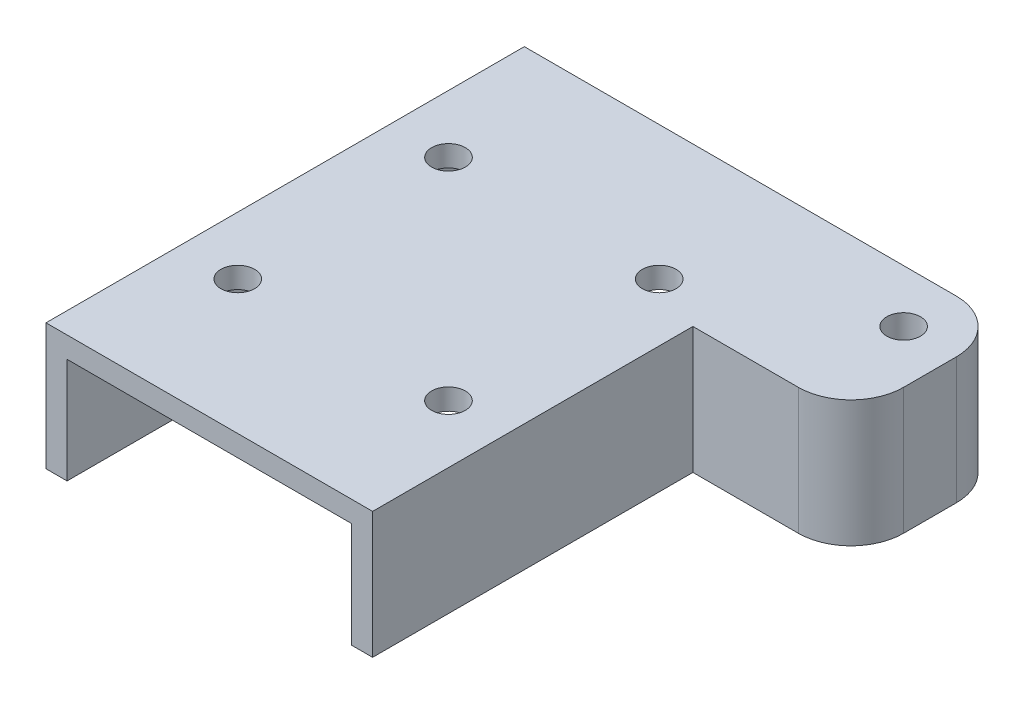
ISO-10303-21;
HEADER;
FILE_DESCRIPTION(('STEP AP214'),'2;1');
FILE_NAME('part.step','',(''),(''),'','','');
FILE_SCHEMA(('AUTOMOTIVE_DESIGN { 1 0 10303 214 1 1 1 1 }'));
ENDSEC;
DATA;
#1=APPLICATION_CONTEXT('core data for automotive mechanical design processes');
#2=APPLICATION_PROTOCOL_DEFINITION('international standard','automotive_design',2000,#1);
#3=PRODUCT_CONTEXT('',#1,'mechanical');
#4=PRODUCT('Part','Part','',(#3));
#5=PRODUCT_RELATED_PRODUCT_CATEGORY('part','',(#4));
#6=PRODUCT_DEFINITION_FORMATION('','',#4);
#7=PRODUCT_DEFINITION_CONTEXT('part definition',#1,'design');
#8=PRODUCT_DEFINITION('design','',#6,#7);
#9=PRODUCT_DEFINITION_SHAPE('','',#8);
#10=(LENGTH_UNIT() NAMED_UNIT(*) SI_UNIT(.MILLI.,.METRE.));
#11=(NAMED_UNIT(*) PLANE_ANGLE_UNIT() SI_UNIT($,.RADIAN.));
#12=(NAMED_UNIT(*) SI_UNIT($,.STERADIAN.) SOLID_ANGLE_UNIT());
#13=UNCERTAINTY_MEASURE_WITH_UNIT(LENGTH_MEASURE(1.E-05),#10,'distance_accuracy_value','');
#14=(GEOMETRIC_REPRESENTATION_CONTEXT(3) GLOBAL_UNCERTAINTY_ASSIGNED_CONTEXT((#13)) GLOBAL_UNIT_ASSIGNED_CONTEXT((#10,
#11,#12)) REPRESENTATION_CONTEXT('',''));
#15=CARTESIAN_POINT('',(0.,0.,0.));
#16=DIRECTION('',(0.,0.,1.));
#17=DIRECTION('',(1.,0.,0.));
#18=AXIS2_PLACEMENT_3D('',#15,#16,#17);
#19=CARTESIAN_POINT('',(62.,12.,-90.8));
#20=DIRECTION('',(-1.,0.,0.));
#21=DIRECTION('',(0.,0.,1.));
#22=AXIS2_PLACEMENT_3D('',#19,#20,#21);
#23=PLANE('',#22);
#24=DIRECTION('',(0.,-1.,0.));
#25=VECTOR('',#24,1.);
#26=CARTESIAN_POINT('',(62.,12.,-75.8));
#27=LINE('',#26,#25);
#28=CARTESIAN_POINT('',(62.,12.,-75.8));
#29=VERTEX_POINT('',#28);
#30=CARTESIAN_POINT('',(62.,0.,-75.8));
#31=VERTEX_POINT('',#30);
#32=EDGE_CURVE('E140',#29,#31,#27,.T.);
#33=ORIENTED_EDGE('',*,*,#32,.F.);
#34=DIRECTION('',(0.,0.,-1.));
#35=VECTOR('',#34,1.);
#36=CARTESIAN_POINT('',(62.,12.,-90.8));
#37=LINE('',#36,#35);
#38=CARTESIAN_POINT('',(62.,12.,-45.4));
#39=VERTEX_POINT('',#38);
#40=EDGE_CURVE('E198',#39,#29,#37,.T.);
#41=ORIENTED_EDGE('',*,*,#40,.F.);
#42=DIRECTION('',(0.,-1.,0.));
#43=VECTOR('',#42,1.);
#44=CARTESIAN_POINT('',(62.,12.,-45.4));
#45=LINE('',#44,#43);
#46=CARTESIAN_POINT('',(62.,0.,-45.4));
#47=VERTEX_POINT('',#46);
#48=EDGE_CURVE('E142',#39,#47,#45,.T.);
#49=ORIENTED_EDGE('',*,*,#48,.T.);
#50=DIRECTION('',(0.,0.,-1.));
#51=VECTOR('',#50,1.);
#52=CARTESIAN_POINT('',(62.,0.,-90.8));
#53=LINE('',#52,#51);
#54=EDGE_CURVE('E129',#47,#31,#53,.T.);
#55=ORIENTED_EDGE('',*,*,#54,.T.);
#56=EDGE_LOOP('',(#33,#41,#49,#55));
#57=FACE_BOUND('',#56,.T.);
#58=ADVANCED_FACE('F34',(#57),#23,.F.);
#59=CARTESIAN_POINT('',(62.,0.,-90.8));
#60=DIRECTION('',(0.,-1.,0.));
#61=DIRECTION('',(0.,0.,1.));
#62=AXIS2_PLACEMENT_3D('',#59,#60,#61);
#63=PLANE('',#62);
#64=CARTESIAN_POINT('',(72.,0.,-85.8));
#65=DIRECTION('',(0.,-1.,0.));
#66=DIRECTION('',(0.,0.,1.));
#67=AXIS2_PLACEMENT_3D('',#64,#65,#66);
#68=CIRCLE('',#67,1.6);
#69=CARTESIAN_POINT('',(72.,0.,-84.2));
#70=VERTEX_POINT('',#69);
#71=EDGE_CURVE('E150',#70,#70,#68,.T.);
#72=ORIENTED_EDGE('',*,*,#71,.F.);
#73=EDGE_LOOP('',(#72));
#74=FACE_BOUND('',#73,.T.);
#75=DIRECTION('',(0.,0.,-1.));
#76=VECTOR('',#75,1.);
#77=CARTESIAN_POINT('',(77.,0.,-75.8));
#78=LINE('',#77,#76);
#79=CARTESIAN_POINT('',(77.,0.,-80.8));
#80=VERTEX_POINT('',#79);
#81=CARTESIAN_POINT('',(77.,0.,-85.8));
#82=VERTEX_POINT('',#81);
#83=EDGE_CURVE('E149',#80,#82,#78,.T.);
#84=ORIENTED_EDGE('',*,*,#83,.F.);
#85=CARTESIAN_POINT('',(72.,0.,-80.8));
#86=DIRECTION('',(0.,-1.,0.));
#87=DIRECTION('',(0.,0.,1.));
#88=AXIS2_PLACEMENT_3D('',#85,#86,#87);
#89=CIRCLE('',#88,5.);
#90=CARTESIAN_POINT('',(72.,0.,-75.8));
#91=VERTEX_POINT('',#90);
#92=EDGE_CURVE('E132',#80,#91,#89,.T.);
#93=ORIENTED_EDGE('',*,*,#92,.T.);
#94=DIRECTION('',(-1.,0.,0.));
#95=VECTOR('',#94,1.);
#96=CARTESIAN_POINT('',(77.,0.,-75.8));
#97=LINE('',#96,#95);
#98=EDGE_CURVE('E124',#91,#31,#97,.T.);
#99=ORIENTED_EDGE('',*,*,#98,.T.);
#100=ORIENTED_EDGE('',*,*,#54,.F.);
#101=DIRECTION('',(1.,0.,0.));
#102=VECTOR('',#101,1.);
#103=CARTESIAN_POINT('',(62.,0.,-45.4));
#104=LINE('',#103,#102);
#105=CARTESIAN_POINT('',(60.,0.,-45.4));
#106=VERTEX_POINT('',#105);
#107=EDGE_CURVE('E214',#106,#47,#104,.T.);
#108=ORIENTED_EDGE('',*,*,#107,.F.);
#109=DIRECTION('',(0.,0.,-1.));
#110=VECTOR('',#109,1.);
#111=CARTESIAN_POINT('',(60.,0.,-45.4));
#112=LINE('',#111,#110);
#113=CARTESIAN_POINT('',(60.,0.,-90.8));
#114=VERTEX_POINT('',#113);
#115=EDGE_CURVE('E182',#106,#114,#112,.T.);
#116=ORIENTED_EDGE('',*,*,#115,.T.);
#117=DIRECTION('',(-1.,0.,0.));
#118=VECTOR('',#117,1.);
#119=CARTESIAN_POINT('',(62.,0.,-90.8));
#120=LINE('',#119,#118);
#121=CARTESIAN_POINT('',(72.,0.,-90.8));
#122=VERTEX_POINT('',#121);
#123=EDGE_CURVE('E208',#122,#114,#120,.T.);
#124=ORIENTED_EDGE('',*,*,#123,.F.);
#125=CARTESIAN_POINT('',(72.,0.,-85.8));
#126=DIRECTION('',(0.,-1.,0.));
#127=DIRECTION('',(0.,0.,1.));
#128=AXIS2_PLACEMENT_3D('',#125,#126,#127);
#129=CIRCLE('',#128,5.);
#130=EDGE_CURVE('E238',#122,#82,#129,.T.);
#131=ORIENTED_EDGE('',*,*,#130,.T.);
#132=EDGE_LOOP('',(#84,#93,#99,#100,#108,#116,#124,#131));
#133=FACE_BOUND('',#132,.T.);
#134=ADVANCED_FACE('F127',(#74,#133),#63,.T.);
#135=CARTESIAN_POINT('',(62.,12.,-90.8));
#136=DIRECTION('',(0.,0.,1.));
#137=DIRECTION('',(1.,0.,0.));
#138=AXIS2_PLACEMENT_3D('',#135,#136,#137);
#139=PLANE('',#138);
#140=DIRECTION('',(-1.,0.,0.));
#141=VECTOR('',#140,1.);
#142=CARTESIAN_POINT('',(62.,12.,-90.8));
#143=LINE('',#142,#141);
#144=CARTESIAN_POINT('',(72.,12.,-90.8));
#145=VERTEX_POINT('',#144);
#146=CARTESIAN_POINT('',(31.,12.,-90.8));
#147=VERTEX_POINT('',#146);
#148=EDGE_CURVE('E200',#145,#147,#143,.T.);
#149=ORIENTED_EDGE('',*,*,#148,.F.);
#150=DIRECTION('',(0.,1.,0.));
#151=VECTOR('',#150,1.);
#152=CARTESIAN_POINT('',(72.,0.,-90.8));
#153=LINE('',#152,#151);
#154=EDGE_CURVE('E11',#145,#122,#153,.F.);
#155=ORIENTED_EDGE('',*,*,#154,.T.);
#156=ORIENTED_EDGE('',*,*,#123,.T.);
#157=DIRECTION('',(0.,-1.,0.));
#158=VECTOR('',#157,1.);
#159=CARTESIAN_POINT('',(60.,0.,-90.8));
#160=LINE('',#159,#158);
#161=CARTESIAN_POINT('',(60.,10.,-90.8));
#162=VERTEX_POINT('',#161);
#163=EDGE_CURVE('E183',#162,#114,#160,.T.);
#164=ORIENTED_EDGE('',*,*,#163,.F.);
#165=DIRECTION('',(1.,0.,0.));
#166=VECTOR('',#165,1.);
#167=CARTESIAN_POINT('',(60.,10.,-90.8));
#168=LINE('',#167,#166);
#169=CARTESIAN_POINT('',(33.,10.,-90.8));
#170=VERTEX_POINT('',#169);
#171=EDGE_CURVE('E176',#170,#162,#168,.T.);
#172=ORIENTED_EDGE('',*,*,#171,.F.);
#173=DIRECTION('',(0.,1.,0.));
#174=VECTOR('',#173,1.);
#175=CARTESIAN_POINT('',(33.,0.,-90.8));
#176=LINE('',#175,#174);
#177=CARTESIAN_POINT('',(33.,0.,-90.8));
#178=VERTEX_POINT('',#177);
#179=EDGE_CURVE('E185',#178,#170,#176,.T.);
#180=ORIENTED_EDGE('',*,*,#179,.F.);
#181=CARTESIAN_POINT('',(31.,0.,-90.8));
#182=VERTEX_POINT('',#181);
#183=EDGE_CURVE('E143',#178,#182,#120,.T.);
#184=ORIENTED_EDGE('',*,*,#183,.T.);
#185=DIRECTION('',(0.,-1.,0.));
#186=VECTOR('',#185,1.);
#187=CARTESIAN_POINT('',(31.,12.,-90.8));
#188=LINE('',#187,#186);
#189=EDGE_CURVE('E221',#147,#182,#188,.T.);
#190=ORIENTED_EDGE('',*,*,#189,.F.);
#191=EDGE_LOOP('',(#149,#155,#156,#164,#172,#180,#184,#190));
#192=FACE_BOUND('',#191,.T.);
#193=ADVANCED_FACE('F256',(#192),#139,.F.);
#194=CARTESIAN_POINT('',(31.,12.,-90.8));
#195=DIRECTION('',(1.,0.,0.));
#196=DIRECTION('',(0.,0.,-1.));
#197=AXIS2_PLACEMENT_3D('',#194,#195,#196);
#198=PLANE('',#197);
#199=DIRECTION('',(0.,0.,1.));
#200=VECTOR('',#199,1.);
#201=CARTESIAN_POINT('',(31.,0.,-90.8));
#202=LINE('',#201,#200);
#203=CARTESIAN_POINT('',(31.,0.,-45.4));
#204=VERTEX_POINT('',#203);
#205=EDGE_CURVE('E211',#182,#204,#202,.T.);
#206=ORIENTED_EDGE('',*,*,#205,.T.);
#207=DIRECTION('',(0.,-1.,0.));
#208=VECTOR('',#207,1.);
#209=CARTESIAN_POINT('',(31.,12.,-45.4));
#210=LINE('',#209,#208);
#211=CARTESIAN_POINT('',(31.,12.,-45.4));
#212=VERTEX_POINT('',#211);
#213=EDGE_CURVE('E218',#212,#204,#210,.T.);
#214=ORIENTED_EDGE('',*,*,#213,.F.);
#215=DIRECTION('',(0.,0.,1.));
#216=VECTOR('',#215,1.);
#217=CARTESIAN_POINT('',(31.,12.,-90.8));
#218=LINE('',#217,#216);
#219=EDGE_CURVE('E203',#147,#212,#218,.T.);
#220=ORIENTED_EDGE('',*,*,#219,.F.);
#221=ORIENTED_EDGE('',*,*,#189,.T.);
#222=EDGE_LOOP('',(#206,#214,#220,#221));
#223=FACE_BOUND('',#222,.T.);
#224=ADVANCED_FACE('F260',(#223),#198,.F.);
#225=CARTESIAN_POINT('',(62.,12.,-45.4));
#226=DIRECTION('',(0.,0.,-1.));
#227=DIRECTION('',(-1.,0.,0.));
#228=AXIS2_PLACEMENT_3D('',#225,#226,#227);
#229=PLANE('',#228);
#230=DIRECTION('',(1.,0.,0.));
#231=VECTOR('',#230,1.);
#232=CARTESIAN_POINT('',(60.,10.,-45.4));
#233=LINE('',#232,#231);
#234=CARTESIAN_POINT('',(33.,10.,-45.4));
#235=VERTEX_POINT('',#234);
#236=CARTESIAN_POINT('',(60.,10.,-45.4));
#237=VERTEX_POINT('',#236);
#238=EDGE_CURVE('E179',#235,#237,#233,.T.);
#239=ORIENTED_EDGE('',*,*,#238,.T.);
#240=DIRECTION('',(0.,-1.,0.));
#241=VECTOR('',#240,1.);
#242=CARTESIAN_POINT('',(60.,0.,-45.4));
#243=LINE('',#242,#241);
#244=EDGE_CURVE('E173',#237,#106,#243,.T.);
#245=ORIENTED_EDGE('',*,*,#244,.T.);
#246=ORIENTED_EDGE('',*,*,#107,.T.);
#247=ORIENTED_EDGE('',*,*,#48,.F.);
#248=DIRECTION('',(1.,0.,0.));
#249=VECTOR('',#248,1.);
#250=CARTESIAN_POINT('',(62.,12.,-45.4));
#251=LINE('',#250,#249);
#252=EDGE_CURVE('E206',#212,#39,#251,.T.);
#253=ORIENTED_EDGE('',*,*,#252,.F.);
#254=ORIENTED_EDGE('',*,*,#213,.T.);
#255=CARTESIAN_POINT('',(33.,0.,-45.4));
#256=VERTEX_POINT('',#255);
#257=EDGE_CURVE('E201',#204,#256,#104,.T.);
#258=ORIENTED_EDGE('',*,*,#257,.T.);
#259=DIRECTION('',(0.,1.,0.));
#260=VECTOR('',#259,1.);
#261=CARTESIAN_POINT('',(33.,0.,-45.4));
#262=LINE('',#261,#260);
#263=EDGE_CURVE('E175',#256,#235,#262,.T.);
#264=ORIENTED_EDGE('',*,*,#263,.T.);
#265=EDGE_LOOP('',(#239,#245,#246,#247,#253,#254,#258,#264));
#266=FACE_BOUND('',#265,.T.);
#267=ADVANCED_FACE('F262',(#266),#229,.F.);
#268=CARTESIAN_POINT('',(62.,12.,-90.8));
#269=DIRECTION('',(0.,-1.,0.));
#270=DIRECTION('',(0.,0.,1.));
#271=AXIS2_PLACEMENT_3D('',#268,#269,#270);
#272=PLANE('',#271);
#273=CARTESIAN_POINT('',(72.,12.,-85.8));
#274=DIRECTION('',(0.,1.,0.));
#275=DIRECTION('',(0.,0.,-1.));
#276=AXIS2_PLACEMENT_3D('',#273,#274,#275);
#277=CIRCLE('',#276,1.6);
#278=CARTESIAN_POINT('',(72.,12.,-87.4));
#279=VERTEX_POINT('',#278);
#280=EDGE_CURVE('E156',#279,#279,#277,.T.);
#281=ORIENTED_EDGE('',*,*,#280,.F.);
#282=EDGE_LOOP('',(#281));
#283=FACE_BOUND('',#282,.T.);
#284=CARTESIAN_POINT('',(56.5,12.,-58.1));
#285=DIRECTION('',(0.,1.,0.));
#286=DIRECTION('',(0.,0.,-1.));
#287=AXIS2_PLACEMENT_3D('',#284,#285,#286);
#288=CIRCLE('',#287,1.6);
#289=CARTESIAN_POINT('',(56.5,12.,-59.7));
#290=VERTEX_POINT('',#289);
#291=EDGE_CURVE('E164',#290,#290,#288,.T.);
#292=ORIENTED_EDGE('',*,*,#291,.F.);
#293=EDGE_LOOP('',(#292));
#294=FACE_BOUND('',#293,.T.);
#295=CARTESIAN_POINT('',(36.5,12.,-78.1));
#296=DIRECTION('',(0.,1.,0.));
#297=DIRECTION('',(0.,0.,-1.));
#298=AXIS2_PLACEMENT_3D('',#295,#296,#297);
#299=CIRCLE('',#298,1.6);
#300=CARTESIAN_POINT('',(36.5,12.,-79.7));
#301=VERTEX_POINT('',#300);
#302=EDGE_CURVE('E163',#301,#301,#299,.T.);
#303=ORIENTED_EDGE('',*,*,#302,.F.);
#304=EDGE_LOOP('',(#303));
#305=FACE_BOUND('',#304,.T.);
#306=CARTESIAN_POINT('',(56.5,12.,-78.1));
#307=DIRECTION('',(0.,1.,0.));
#308=DIRECTION('',(0.,0.,-1.));
#309=AXIS2_PLACEMENT_3D('',#306,#307,#308);
#310=CIRCLE('',#309,1.6);
#311=CARTESIAN_POINT('',(56.5,12.,-79.7));
#312=VERTEX_POINT('',#311);
#313=EDGE_CURVE('E134',#312,#312,#310,.T.);
#314=ORIENTED_EDGE('',*,*,#313,.F.);
#315=EDGE_LOOP('',(#314));
#316=FACE_BOUND('',#315,.T.);
#317=CARTESIAN_POINT('',(36.5,12.,-58.1));
#318=DIRECTION('',(0.,1.,0.));
#319=DIRECTION('',(0.,0.,-1.));
#320=AXIS2_PLACEMENT_3D('',#317,#318,#319);
#321=CIRCLE('',#320,1.6);
#322=CARTESIAN_POINT('',(36.5,12.,-59.7));
#323=VERTEX_POINT('',#322);
#324=EDGE_CURVE('E167',#323,#323,#321,.T.);
#325=ORIENTED_EDGE('',*,*,#324,.F.);
#326=EDGE_LOOP('',(#325));
#327=FACE_BOUND('',#326,.T.);
#328=DIRECTION('',(-1.,0.,0.));
#329=VECTOR('',#328,1.);
#330=CARTESIAN_POINT('',(77.,12.,-75.8));
#331=LINE('',#330,#329);
#332=CARTESIAN_POINT('',(72.,12.,-75.8));
#333=VERTEX_POINT('',#332);
#334=EDGE_CURVE('E135',#333,#29,#331,.T.);
#335=ORIENTED_EDGE('',*,*,#334,.F.);
#336=CARTESIAN_POINT('',(72.,12.,-80.8));
#337=DIRECTION('',(0.,-1.,0.));
#338=DIRECTION('',(0.,0.,1.));
#339=AXIS2_PLACEMENT_3D('',#336,#337,#338);
#340=CIRCLE('',#339,5.);
#341=CARTESIAN_POINT('',(77.,12.,-80.8));
#342=VERTEX_POINT('',#341);
#343=EDGE_CURVE('E42',#333,#342,#340,.F.);
#344=ORIENTED_EDGE('',*,*,#343,.T.);
#345=DIRECTION('',(0.,0.,1.));
#346=VECTOR('',#345,1.);
#347=CARTESIAN_POINT('',(77.,12.,-75.8));
#348=LINE('',#347,#346);
#349=CARTESIAN_POINT('',(77.,12.,-85.8));
#350=VERTEX_POINT('',#349);
#351=EDGE_CURVE('E153',#350,#342,#348,.T.);
#352=ORIENTED_EDGE('',*,*,#351,.F.);
#353=CARTESIAN_POINT('',(72.,12.,-85.8));
#354=DIRECTION('',(0.,-1.,0.));
#355=DIRECTION('',(0.,0.,1.));
#356=AXIS2_PLACEMENT_3D('',#353,#354,#355);
#357=CIRCLE('',#356,5.);
#358=EDGE_CURVE('E49',#350,#145,#357,.F.);
#359=ORIENTED_EDGE('',*,*,#358,.T.);
#360=ORIENTED_EDGE('',*,*,#148,.T.);
#361=ORIENTED_EDGE('',*,*,#219,.T.);
#362=ORIENTED_EDGE('',*,*,#252,.T.);
#363=ORIENTED_EDGE('',*,*,#40,.T.);
#364=EDGE_LOOP('',(#335,#344,#352,#359,#360,#361,#362,#363));
#365=FACE_BOUND('',#364,.T.);
#366=ADVANCED_FACE('F244',(#283,#294,#305,#316,#327,#365),#272,.F.);
#367=DIRECTION('',(0.,0.,-1.));
#368=VECTOR('',#367,1.);
#369=CARTESIAN_POINT('',(33.,0.,-45.4));
#370=LINE('',#369,#368);
#371=EDGE_CURVE('E194',#256,#178,#370,.T.);
#372=ORIENTED_EDGE('',*,*,#371,.F.);
#373=ORIENTED_EDGE('',*,*,#257,.F.);
#374=ORIENTED_EDGE('',*,*,#205,.F.);
#375=ORIENTED_EDGE('',*,*,#183,.F.);
#376=EDGE_LOOP('',(#372,#373,#374,#375));
#377=FACE_BOUND('',#376,.T.);
#378=ADVANCED_FACE('F278',(#377),#63,.T.);
#379=CARTESIAN_POINT('',(60.,0.,-45.4));
#380=DIRECTION('',(1.,0.,0.));
#381=DIRECTION('',(0.,0.,-1.));
#382=AXIS2_PLACEMENT_3D('',#379,#380,#381);
#383=PLANE('',#382);
#384=ORIENTED_EDGE('',*,*,#163,.T.);
#385=ORIENTED_EDGE('',*,*,#115,.F.);
#386=ORIENTED_EDGE('',*,*,#244,.F.);
#387=DIRECTION('',(0.,0.,-1.));
#388=VECTOR('',#387,1.);
#389=CARTESIAN_POINT('',(60.,10.,-45.4));
#390=LINE('',#389,#388);
#391=EDGE_CURVE('E144',#237,#162,#390,.T.);
#392=ORIENTED_EDGE('',*,*,#391,.T.);
#393=EDGE_LOOP('',(#384,#385,#386,#392));
#394=FACE_BOUND('',#393,.T.);
#395=ADVANCED_FACE('F266',(#394),#383,.F.);
#396=CARTESIAN_POINT('',(60.,10.,-45.4));
#397=DIRECTION('',(0.,1.,0.));
#398=DIRECTION('',(0.,0.,-1.));
#399=AXIS2_PLACEMENT_3D('',#396,#397,#398);
#400=PLANE('',#399);
#401=CARTESIAN_POINT('',(56.5,10.,-58.1));
#402=DIRECTION('',(0.,1.,0.));
#403=DIRECTION('',(0.,0.,-1.));
#404=AXIS2_PLACEMENT_3D('',#401,#402,#403);
#405=CIRCLE('',#404,1.6);
#406=CARTESIAN_POINT('',(56.5,10.,-59.7));
#407=VERTEX_POINT('',#406);
#408=EDGE_CURVE('E186',#407,#407,#405,.T.);
#409=ORIENTED_EDGE('',*,*,#408,.T.);
#410=EDGE_LOOP('',(#409));
#411=FACE_BOUND('',#410,.T.);
#412=CARTESIAN_POINT('',(36.5,10.,-78.1));
#413=DIRECTION('',(0.,1.,0.));
#414=DIRECTION('',(0.,0.,-1.));
#415=AXIS2_PLACEMENT_3D('',#412,#413,#414);
#416=CIRCLE('',#415,1.6);
#417=CARTESIAN_POINT('',(36.5,10.,-79.7));
#418=VERTEX_POINT('',#417);
#419=EDGE_CURVE('E230',#418,#418,#416,.T.);
#420=ORIENTED_EDGE('',*,*,#419,.T.);
#421=EDGE_LOOP('',(#420));
#422=FACE_BOUND('',#421,.T.);
#423=CARTESIAN_POINT('',(56.5,10.,-78.1));
#424=DIRECTION('',(0.,1.,0.));
#425=DIRECTION('',(0.,0.,-1.));
#426=AXIS2_PLACEMENT_3D('',#423,#424,#425);
#427=CIRCLE('',#426,1.6);
#428=CARTESIAN_POINT('',(56.5,10.,-79.7));
#429=VERTEX_POINT('',#428);
#430=EDGE_CURVE('E227',#429,#429,#427,.T.);
#431=ORIENTED_EDGE('',*,*,#430,.T.);
#432=EDGE_LOOP('',(#431));
#433=FACE_BOUND('',#432,.T.);
#434=CARTESIAN_POINT('',(36.5,10.,-58.1));
#435=DIRECTION('',(0.,1.,0.));
#436=DIRECTION('',(0.,0.,-1.));
#437=AXIS2_PLACEMENT_3D('',#434,#435,#436);
#438=CIRCLE('',#437,1.6);
#439=CARTESIAN_POINT('',(36.5,10.,-59.7));
#440=VERTEX_POINT('',#439);
#441=EDGE_CURVE('E172',#440,#440,#438,.T.);
#442=ORIENTED_EDGE('',*,*,#441,.T.);
#443=EDGE_LOOP('',(#442));
#444=FACE_BOUND('',#443,.T.);
#445=ORIENTED_EDGE('',*,*,#171,.T.);
#446=ORIENTED_EDGE('',*,*,#391,.F.);
#447=ORIENTED_EDGE('',*,*,#238,.F.);
#448=DIRECTION('',(0.,0.,-1.));
#449=VECTOR('',#448,1.);
#450=CARTESIAN_POINT('',(33.,10.,-45.4));
#451=LINE('',#450,#449);
#452=EDGE_CURVE('E192',#235,#170,#451,.T.);
#453=ORIENTED_EDGE('',*,*,#452,.T.);
#454=EDGE_LOOP('',(#445,#446,#447,#453));
#455=FACE_BOUND('',#454,.T.);
#456=ADVANCED_FACE('F271',(#411,#422,#433,#444,#455),#400,.F.);
#457=CARTESIAN_POINT('',(33.,0.,-45.4));
#458=DIRECTION('',(-1.,0.,0.));
#459=DIRECTION('',(0.,0.,1.));
#460=AXIS2_PLACEMENT_3D('',#457,#458,#459);
#461=PLANE('',#460);
#462=ORIENTED_EDGE('',*,*,#179,.T.);
#463=ORIENTED_EDGE('',*,*,#452,.F.);
#464=ORIENTED_EDGE('',*,*,#263,.F.);
#465=ORIENTED_EDGE('',*,*,#371,.T.);
#466=EDGE_LOOP('',(#462,#463,#464,#465));
#467=FACE_BOUND('',#466,.T.);
#468=ADVANCED_FACE('F275',(#467),#461,.F.);
#469=CARTESIAN_POINT('',(36.5,2.,-58.1));
#470=DIRECTION('',(0.,1.,0.));
#471=DIRECTION('',(0.,0.,-1.));
#472=AXIS2_PLACEMENT_3D('',#469,#470,#471);
#473=CYLINDRICAL_SURFACE('',#472,1.6);
#474=ORIENTED_EDGE('',*,*,#324,.T.);
#475=EDGE_LOOP('',(#474));
#476=FACE_BOUND('',#475,.T.);
#477=ORIENTED_EDGE('',*,*,#441,.F.);
#478=EDGE_LOOP('',(#477));
#479=FACE_BOUND('',#478,.T.);
#480=ADVANCED_FACE('F318',(#476,#479),#473,.F.);
#481=CARTESIAN_POINT('',(56.5,2.,-78.1));
#482=DIRECTION('',(0.,1.,0.));
#483=DIRECTION('',(0.,0.,-1.));
#484=AXIS2_PLACEMENT_3D('',#481,#482,#483);
#485=CYLINDRICAL_SURFACE('',#484,1.6);
#486=ORIENTED_EDGE('',*,*,#313,.T.);
#487=EDGE_LOOP('',(#486));
#488=FACE_BOUND('',#487,.T.);
#489=ORIENTED_EDGE('',*,*,#430,.F.);
#490=EDGE_LOOP('',(#489));
#491=FACE_BOUND('',#490,.T.);
#492=ADVANCED_FACE('F314',(#488,#491),#485,.F.);
#493=CARTESIAN_POINT('',(36.5,2.,-78.1));
#494=DIRECTION('',(0.,1.,0.));
#495=DIRECTION('',(0.,0.,-1.));
#496=AXIS2_PLACEMENT_3D('',#493,#494,#495);
#497=CYLINDRICAL_SURFACE('',#496,1.6);
#498=ORIENTED_EDGE('',*,*,#302,.T.);
#499=EDGE_LOOP('',(#498));
#500=FACE_BOUND('',#499,.T.);
#501=ORIENTED_EDGE('',*,*,#419,.F.);
#502=EDGE_LOOP('',(#501));
#503=FACE_BOUND('',#502,.T.);
#504=ADVANCED_FACE('F317',(#500,#503),#497,.F.);
#505=CARTESIAN_POINT('',(56.5,2.,-58.1));
#506=DIRECTION('',(0.,1.,0.));
#507=DIRECTION('',(0.,0.,-1.));
#508=AXIS2_PLACEMENT_3D('',#505,#506,#507);
#509=CYLINDRICAL_SURFACE('',#508,1.6);
#510=ORIENTED_EDGE('',*,*,#291,.T.);
#511=EDGE_LOOP('',(#510));
#512=FACE_BOUND('',#511,.T.);
#513=ORIENTED_EDGE('',*,*,#408,.F.);
#514=EDGE_LOOP('',(#513));
#515=FACE_BOUND('',#514,.T.);
#516=ADVANCED_FACE('F313',(#512,#515),#509,.F.);
#517=CARTESIAN_POINT('',(77.,12.,-75.8));
#518=DIRECTION('',(0.,0.,-1.));
#519=DIRECTION('',(-1.,0.,0.));
#520=AXIS2_PLACEMENT_3D('',#517,#518,#519);
#521=PLANE('',#520);
#522=ORIENTED_EDGE('',*,*,#98,.F.);
#523=DIRECTION('',(0.,-1.,0.));
#524=VECTOR('',#523,1.);
#525=CARTESIAN_POINT('',(72.,12.,-75.8));
#526=LINE('',#525,#524);
#527=EDGE_CURVE('E57',#91,#333,#526,.F.);
#528=ORIENTED_EDGE('',*,*,#527,.T.);
#529=ORIENTED_EDGE('',*,*,#334,.T.);
#530=ORIENTED_EDGE('',*,*,#32,.T.);
#531=EDGE_LOOP('',(#522,#528,#529,#530));
#532=FACE_BOUND('',#531,.T.);
#533=ADVANCED_FACE('F146',(#532),#521,.F.);
#534=CARTESIAN_POINT('',(77.,0.,-90.8));
#535=DIRECTION('',(1.,0.,0.));
#536=DIRECTION('',(0.,0.,-1.));
#537=AXIS2_PLACEMENT_3D('',#534,#535,#536);
#538=PLANE('',#537);
#539=ORIENTED_EDGE('',*,*,#351,.T.);
#540=DIRECTION('',(0.,-1.,0.));
#541=VECTOR('',#540,1.);
#542=CARTESIAN_POINT('',(77.,0.,-80.8));
#543=LINE('',#542,#541);
#544=EDGE_CURVE('E236',#342,#80,#543,.T.);
#545=ORIENTED_EDGE('',*,*,#544,.T.);
#546=ORIENTED_EDGE('',*,*,#83,.T.);
#547=DIRECTION('',(0.,1.,0.));
#548=VECTOR('',#547,1.);
#549=CARTESIAN_POINT('',(77.,12.,-85.8));
#550=LINE('',#549,#548);
#551=EDGE_CURVE('E224',#82,#350,#550,.T.);
#552=ORIENTED_EDGE('',*,*,#551,.T.);
#553=EDGE_LOOP('',(#539,#545,#546,#552));
#554=FACE_BOUND('',#553,.T.);
#555=ADVANCED_FACE('F249',(#554),#538,.T.);
#556=CARTESIAN_POINT('',(72.,-8.,-85.8));
#557=DIRECTION('',(0.,1.,0.));
#558=DIRECTION('',(0.,0.,-1.));
#559=AXIS2_PLACEMENT_3D('',#556,#557,#558);
#560=CYLINDRICAL_SURFACE('',#559,1.6);
#561=ORIENTED_EDGE('',*,*,#71,.T.);
#562=EDGE_LOOP('',(#561));
#563=FACE_BOUND('',#562,.T.);
#564=ORIENTED_EDGE('',*,*,#280,.T.);
#565=EDGE_LOOP('',(#564));
#566=FACE_BOUND('',#565,.T.);
#567=ADVANCED_FACE('F298',(#563,#566),#560,.F.);
#568=CARTESIAN_POINT('',(72.,0.,-80.8));
#569=DIRECTION('',(0.,1.,0.));
#570=DIRECTION('',(0.,0.,-1.));
#571=AXIS2_PLACEMENT_3D('',#568,#569,#570);
#572=CYLINDRICAL_SURFACE('',#571,5.);
#573=ORIENTED_EDGE('',*,*,#343,.F.);
#574=ORIENTED_EDGE('',*,*,#527,.F.);
#575=ORIENTED_EDGE('',*,*,#92,.F.);
#576=ORIENTED_EDGE('',*,*,#544,.F.);
#577=EDGE_LOOP('',(#573,#574,#575,#576));
#578=FACE_BOUND('',#577,.T.);
#579=ADVANCED_FACE('F247',(#578),#572,.T.);
#580=CARTESIAN_POINT('',(72.,0.,-85.8));
#581=DIRECTION('',(0.,-1.,0.));
#582=DIRECTION('',(-1.,0.,0.));
#583=AXIS2_PLACEMENT_3D('',#580,#581,#582);
#584=CYLINDRICAL_SURFACE('',#583,5.);
#585=ORIENTED_EDGE('',*,*,#130,.F.);
#586=ORIENTED_EDGE('',*,*,#154,.F.);
#587=ORIENTED_EDGE('',*,*,#358,.F.);
#588=ORIENTED_EDGE('',*,*,#551,.F.);
#589=EDGE_LOOP('',(#585,#586,#587,#588));
#590=FACE_BOUND('',#589,.T.);
#591=ADVANCED_FACE('F36',(#590),#584,.T.);
#592=CLOSED_SHELL('',(#58,#134,#193,#224,#267,#366,#378,#395,#456,#468,#480,#492,#504,#516,#533,
#555,#567,#579,#591));
#593=MANIFOLD_SOLID_BREP('B2',#592);
#594=ADVANCED_BREP_SHAPE_REPRESENTATION('',(#18,#593),#14);
#595=SHAPE_DEFINITION_REPRESENTATION(#9,#594);
ENDSEC;
END-ISO-10303-21;
